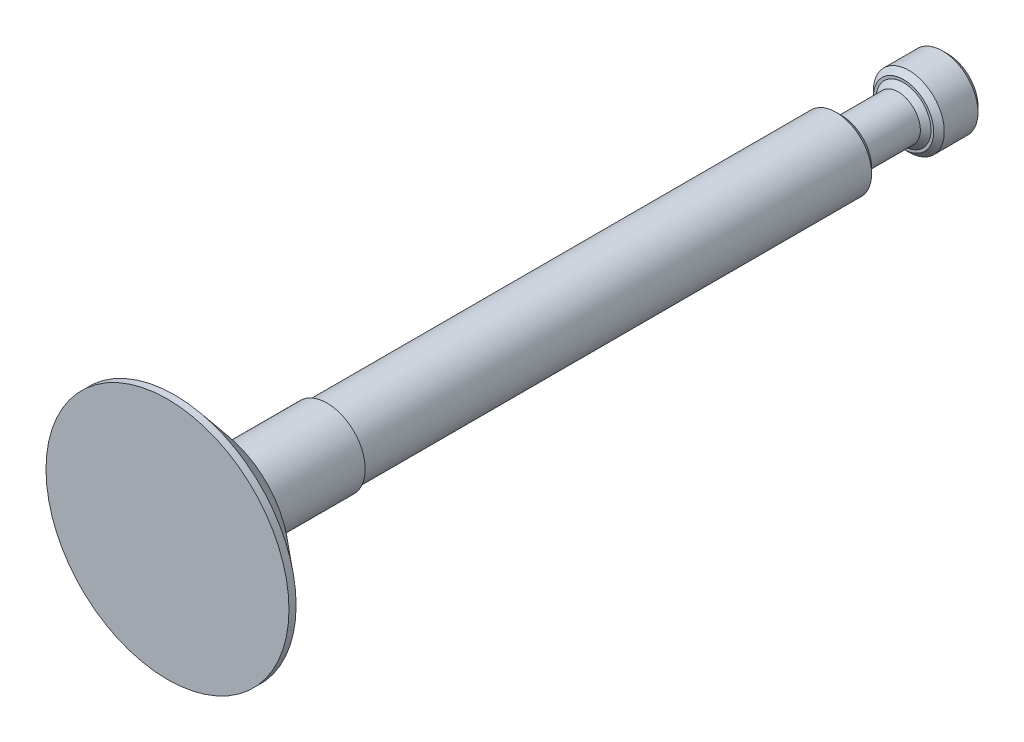
ISO-10303-21;
HEADER;
FILE_DESCRIPTION(('STEP AP214'),'2;1');
FILE_NAME('part.step','',(''),(''),'','','');
FILE_SCHEMA(('AUTOMOTIVE_DESIGN { 1 0 10303 214 1 1 1 1 }'));
ENDSEC;
DATA;
#1=APPLICATION_CONTEXT('core data for automotive mechanical design processes');
#2=APPLICATION_PROTOCOL_DEFINITION('international standard','automotive_design',2000,#1);
#3=PRODUCT_CONTEXT('',#1,'mechanical');
#4=PRODUCT('Part','Part','',(#3));
#5=PRODUCT_RELATED_PRODUCT_CATEGORY('part','',(#4));
#6=PRODUCT_DEFINITION_FORMATION('','',#4);
#7=PRODUCT_DEFINITION_CONTEXT('part definition',#1,'design');
#8=PRODUCT_DEFINITION('design','',#6,#7);
#9=PRODUCT_DEFINITION_SHAPE('','',#8);
#10=(LENGTH_UNIT() NAMED_UNIT(*) SI_UNIT(.MILLI.,.METRE.));
#11=(NAMED_UNIT(*) PLANE_ANGLE_UNIT() SI_UNIT($,.RADIAN.));
#12=(NAMED_UNIT(*) SI_UNIT($,.STERADIAN.) SOLID_ANGLE_UNIT());
#13=UNCERTAINTY_MEASURE_WITH_UNIT(LENGTH_MEASURE(1.E-05),#10,'distance_accuracy_value','');
#14=(GEOMETRIC_REPRESENTATION_CONTEXT(3) GLOBAL_UNCERTAINTY_ASSIGNED_CONTEXT((#13)) GLOBAL_UNIT_ASSIGNED_CONTEXT((#10,
#11,#12)) REPRESENTATION_CONTEXT('',''));
#15=CARTESIAN_POINT('',(0.,0.,0.));
#16=DIRECTION('',(0.,0.,1.));
#17=DIRECTION('',(1.,0.,0.));
#18=AXIS2_PLACEMENT_3D('',#15,#16,#17);
#19=CARTESIAN_POINT('',(0.,0.,2.5));
#20=DIRECTION('',(0.,0.,0.999999999999999));
#21=DIRECTION('',(0.999999999999999,0.,0.));
#22=AXIS2_PLACEMENT_3D('',#19,#20,#21);
#23=PLANE('',#22);
#24=CARTESIAN_POINT('',(0.,0.,2.5));
#25=DIRECTION('',(0.,0.,0.999999999999999));
#26=DIRECTION('',(0.999999999999999,0.,0.));
#27=AXIS2_PLACEMENT_3D('',#24,#25,#26);
#28=CIRCLE('',#27,1.7);
#29=CARTESIAN_POINT('',(-1.7,0.,2.5));
#30=VERTEX_POINT('',#29);
#31=EDGE_CURVE('E41',#30,#30,#28,.T.);
#32=ORIENTED_EDGE('',*,*,#31,.T.);
#33=EDGE_LOOP('',(#32));
#34=FACE_BOUND('',#33,.T.);
#35=CARTESIAN_POINT('',(0.,0.,2.5));
#36=DIRECTION('',(0.,0.,0.999999999999999));
#37=DIRECTION('',(0.999999999999999,0.,0.));
#38=AXIS2_PLACEMENT_3D('',#35,#36,#37);
#39=CIRCLE('',#38,1.55);
#40=CARTESIAN_POINT('',(-1.55,0.,2.5));
#41=VERTEX_POINT('',#40);
#42=EDGE_CURVE('E45',#41,#41,#39,.F.);
#43=ORIENTED_EDGE('',*,*,#42,.T.);
#44=EDGE_LOOP('',(#43));
#45=FACE_BOUND('',#44,.T.);
#46=ADVANCED_FACE('F30',(#34,#45),#23,.T.);
#47=CARTESIAN_POINT('',(0.,0.,2.5));
#48=DIRECTION('',(0.,0.,-0.999999999999999));
#49=DIRECTION('',(-0.999999999999999,0.,0.));
#50=AXIS2_PLACEMENT_3D('',#47,#48,#49);
#51=CYLINDRICAL_SURFACE('',#50,2.);
#52=CARTESIAN_POINT('',(0.,0.,0.299999999999995));
#53=DIRECTION('',(0.,0.,0.999999999999999));
#54=DIRECTION('',(0.999999999999999,0.,0.));
#55=AXIS2_PLACEMENT_3D('',#52,#53,#54);
#56=CIRCLE('',#55,2.);
#57=CARTESIAN_POINT('',(-2.,0.,0.299999999999994));
#58=VERTEX_POINT('',#57);
#59=EDGE_CURVE('E53',#58,#58,#56,.T.);
#60=CARTESIAN_POINT('',(0.,0.,2.20000000000001));
#61=DIRECTION('',(0.,0.,0.999999999999999));
#62=DIRECTION('',(0.999999999999999,0.,0.));
#63=AXIS2_PLACEMENT_3D('',#60,#61,#62);
#64=CIRCLE('',#63,2.);
#65=CARTESIAN_POINT('',(-2.,0.,2.20000000000001));
#66=VERTEX_POINT('',#65);
#67=EDGE_CURVE('E56',#66,#66,#64,.F.);
#68=CARTESIAN_POINT('',(-2.,0.,0.299999999999994));
#69=CARTESIAN_POINT('',(-2.,0.,0.319791666666661));
#70=CARTESIAN_POINT('',(-2.,0.,0.339583333333328));
#71=CARTESIAN_POINT('',(-2.,0.,0.379166666666661));
#72=CARTESIAN_POINT('',(-2.,0.,0.398958333333328));
#73=CARTESIAN_POINT('',(-2.,0.,0.438541666666662));
#74=CARTESIAN_POINT('',(-2.,0.,0.458333333333329));
#75=CARTESIAN_POINT('',(-2.,0.,0.497916666666662));
#76=CARTESIAN_POINT('',(-2.,0.,0.517708333333329));
#77=CARTESIAN_POINT('',(-2.,0.,0.557291666666663));
#78=CARTESIAN_POINT('',(-2.,0.,0.57708333333333));
#79=CARTESIAN_POINT('',(-2.,0.,0.616666666666663));
#80=CARTESIAN_POINT('',(-2.,0.,0.63645833333333));
#81=CARTESIAN_POINT('',(-2.,0.,0.676041666666664));
#82=CARTESIAN_POINT('',(-2.,0.,0.69583333333333));
#83=CARTESIAN_POINT('',(-2.,0.,0.735416666666664));
#84=CARTESIAN_POINT('',(-2.,0.,0.755208333333331));
#85=CARTESIAN_POINT('',(-2.,0.,0.794791666666664));
#86=CARTESIAN_POINT('',(-2.,0.,0.814583333333331));
#87=CARTESIAN_POINT('',(-2.,0.,0.854166666666665));
#88=CARTESIAN_POINT('',(-2.,0.,0.873958333333332));
#89=CARTESIAN_POINT('',(-2.,0.,0.913541666666665));
#90=CARTESIAN_POINT('',(-2.,0.,0.933333333333332));
#91=CARTESIAN_POINT('',(-2.,0.,0.972916666666666));
#92=CARTESIAN_POINT('',(-2.,0.,0.992708333333332));
#93=CARTESIAN_POINT('',(-2.,0.,1.03229166666667));
#94=CARTESIAN_POINT('',(-2.,0.,1.05208333333333));
#95=CARTESIAN_POINT('',(-2.,0.,1.09166666666667));
#96=CARTESIAN_POINT('',(-2.,0.,1.11145833333333));
#97=CARTESIAN_POINT('',(-2.,0.,1.15104166666667));
#98=CARTESIAN_POINT('',(-2.,0.,1.17083333333333));
#99=CARTESIAN_POINT('',(-2.,0.,1.21041666666667));
#100=CARTESIAN_POINT('',(-2.,0.,1.23020833333333));
#101=CARTESIAN_POINT('',(-2.,0.,1.26979166666667));
#102=CARTESIAN_POINT('',(-2.,0.,1.28958333333333));
#103=CARTESIAN_POINT('',(-2.,0.,1.32916666666667));
#104=CARTESIAN_POINT('',(-2.,0.,1.34895833333333));
#105=CARTESIAN_POINT('',(-2.,0.,1.38854166666667));
#106=CARTESIAN_POINT('',(-2.,0.,1.40833333333334));
#107=CARTESIAN_POINT('',(-2.,0.,1.44791666666667));
#108=CARTESIAN_POINT('',(-2.,0.,1.46770833333334));
#109=CARTESIAN_POINT('',(-2.,0.,1.50729166666667));
#110=CARTESIAN_POINT('',(-2.,0.,1.52708333333334));
#111=CARTESIAN_POINT('',(-2.,0.,1.56666666666667));
#112=CARTESIAN_POINT('',(-2.,0.,1.58645833333334));
#113=CARTESIAN_POINT('',(-2.,0.,1.62604166666667));
#114=CARTESIAN_POINT('',(-2.,0.,1.64583333333334));
#115=CARTESIAN_POINT('',(-2.,0.,1.68541666666667));
#116=CARTESIAN_POINT('',(-2.,0.,1.70520833333334));
#117=CARTESIAN_POINT('',(-2.,0.,1.74479166666667));
#118=CARTESIAN_POINT('',(-2.,0.,1.76458333333334));
#119=CARTESIAN_POINT('',(-2.,0.,1.80416666666667));
#120=CARTESIAN_POINT('',(-2.,0.,1.82395833333334));
#121=CARTESIAN_POINT('',(-2.,0.,1.86354166666667));
#122=CARTESIAN_POINT('',(-2.,0.,1.88333333333334));
#123=CARTESIAN_POINT('',(-2.,0.,1.92291666666667));
#124=CARTESIAN_POINT('',(-2.,0.,1.94270833333334));
#125=CARTESIAN_POINT('',(-2.,0.,1.98229166666667));
#126=CARTESIAN_POINT('',(-2.,0.,2.00208333333334));
#127=CARTESIAN_POINT('',(-2.,0.,2.04166666666667));
#128=CARTESIAN_POINT('',(-2.,0.,2.06145833333334));
#129=CARTESIAN_POINT('',(-2.,0.,2.10104166666667));
#130=CARTESIAN_POINT('',(-2.,0.,2.12083333333334));
#131=CARTESIAN_POINT('',(-2.,0.,2.16041666666667));
#132=CARTESIAN_POINT('',(-2.,0.,2.18020833333334));
#133=CARTESIAN_POINT('',(-2.,0.,2.20000000000001));
#134=B_SPLINE_CURVE_WITH_KNOTS('',3,(#68,#69,#70,#71,#72,#73,#74,#75,#76,#77,#78,#79,#80,#81,
#82,#83,#84,#85,#86,#87,#88,#89,#90,#91,#92,#93,#94,#95,#96,#97,#98,#99,#100,#101,#102,#103,
#104,#105,#106,#107,#108,#109,#110,#111,#112,#113,#114,#115,#116,#117,#118,#119,#120,#121,#122,
#123,#124,#125,#126,#127,#128,#129,#130,#131,#132,#133),.UNSPECIFIED.,.F.,.F.,(4,2,2,2,2,2,2,2,
2,2,2,2,2,2,2,2,2,2,2,2,2,2,2,2,2,2,2,2,2,2,2,2,4),(0.,0.0593750000000004,0.118750000000001,
0.178125000000001,0.237500000000002,0.296875000000002,0.356250000000003,0.415625000000003,
0.475000000000003,0.534375000000004,0.593750000000004,0.653125000000005,0.712500000000005,
0.771875000000005,0.831250000000006,0.890625000000006,0.950000000000007,1.00937500000001,
1.06875000000001,1.12812500000001,1.18750000000001,1.24687500000001,1.30625000000001,
1.36562500000001,1.42500000000001,1.48437500000001,1.54375000000001,1.60312500000001,
1.66250000000001,1.72187500000001,1.78125000000001,1.84062500000001,1.90000000000001),.UNSPECIFIED.);
#135=EDGE_CURVE('BSEAM32',#58,#66,#134,.T.);
#136=ORIENTED_EDGE('',*,*,#59,.T.);
#137=ORIENTED_EDGE('',*,*,#67,.T.);
#138=ORIENTED_EDGE('',*,*,#135,.T.);
#139=ORIENTED_EDGE('',*,*,#135,.F.);
#140=EDGE_LOOP('',(#136,#138,#137,#139));
#141=FACE_BOUND('',#140,.T.);
#142=ADVANCED_FACE('F32',(#141),#51,.T.);
#143=CARTESIAN_POINT('',(0.,0.,6.00000000000001));
#144=DIRECTION('',(0.,0.,-0.999999999999999));
#145=DIRECTION('',(-0.999999999999999,0.,0.));
#146=AXIS2_PLACEMENT_3D('',#143,#144,#145);
#147=CYLINDRICAL_SURFACE('',#146,1.25);
#148=CARTESIAN_POINT('',(0.,0.,5.69999999999998));
#149=DIRECTION('',(0.,0.,0.999999999999999));
#150=DIRECTION('',(0.999999999999999,0.,0.));
#151=AXIS2_PLACEMENT_3D('',#148,#149,#150);
#152=CIRCLE('',#151,1.25);
#153=CARTESIAN_POINT('',(-1.25,0.,5.69999999999998));
#154=VERTEX_POINT('',#153);
#155=EDGE_CURVE('E62',#154,#154,#152,.F.);
#156=CARTESIAN_POINT('',(0.,0.,2.8));
#157=DIRECTION('',(0.,0.,0.999999999999999));
#158=DIRECTION('',(0.999999999999999,0.,0.));
#159=AXIS2_PLACEMENT_3D('',#156,#157,#158);
#160=CIRCLE('',#159,1.25);
#161=CARTESIAN_POINT('',(-1.25,0.,2.8));
#162=VERTEX_POINT('',#161);
#163=EDGE_CURVE('E65',#162,#162,#160,.T.);
#164=CARTESIAN_POINT('',(-1.25,0.,5.69999999999998));
#165=CARTESIAN_POINT('',(-1.25,0.,5.66979166666665));
#166=CARTESIAN_POINT('',(-1.25,0.,5.63958333333332));
#167=CARTESIAN_POINT('',(-1.25,0.,5.57916666666665));
#168=CARTESIAN_POINT('',(-1.25,0.,5.54895833333332));
#169=CARTESIAN_POINT('',(-1.25,0.,5.48854166666665));
#170=CARTESIAN_POINT('',(-1.25,0.,5.45833333333332));
#171=CARTESIAN_POINT('',(-1.25,0.,5.39791666666665));
#172=CARTESIAN_POINT('',(-1.25,0.,5.36770833333332));
#173=CARTESIAN_POINT('',(-1.25,0.,5.30729166666665));
#174=CARTESIAN_POINT('',(-1.25,0.,5.27708333333332));
#175=CARTESIAN_POINT('',(-1.25,0.,5.21666666666665));
#176=CARTESIAN_POINT('',(-1.25,0.,5.18645833333332));
#177=CARTESIAN_POINT('',(-1.25,0.,5.12604166666665));
#178=CARTESIAN_POINT('',(-1.25,0.,5.09583333333332));
#179=CARTESIAN_POINT('',(-1.25,0.,5.03541666666665));
#180=CARTESIAN_POINT('',(-1.25,0.,5.00520833333332));
#181=CARTESIAN_POINT('',(-1.25,0.,4.94479166666665));
#182=CARTESIAN_POINT('',(-1.25,0.,4.91458333333332));
#183=CARTESIAN_POINT('',(-1.25,0.,4.85416666666665));
#184=CARTESIAN_POINT('',(-1.25,0.,4.82395833333332));
#185=CARTESIAN_POINT('',(-1.25,0.,4.76354166666665));
#186=CARTESIAN_POINT('',(-1.25,0.,4.73333333333332));
#187=CARTESIAN_POINT('',(-1.25,0.,4.67291666666665));
#188=CARTESIAN_POINT('',(-1.25,0.,4.64270833333332));
#189=CARTESIAN_POINT('',(-1.25,0.,4.58229166666665));
#190=CARTESIAN_POINT('',(-1.25,0.,4.55208333333332));
#191=CARTESIAN_POINT('',(-1.25,0.,4.49166666666665));
#192=CARTESIAN_POINT('',(-1.25,0.,4.46145833333332));
#193=CARTESIAN_POINT('',(-1.25,0.,4.40104166666666));
#194=CARTESIAN_POINT('',(-1.25,0.,4.37083333333332));
#195=CARTESIAN_POINT('',(-1.25,0.,4.31041666666666));
#196=CARTESIAN_POINT('',(-1.25,0.,4.28020833333332));
#197=CARTESIAN_POINT('',(-1.25,0.,4.21979166666666));
#198=CARTESIAN_POINT('',(-1.25,0.,4.18958333333332));
#199=CARTESIAN_POINT('',(-1.25,0.,4.12916666666666));
#200=CARTESIAN_POINT('',(-1.25,0.,4.09895833333332));
#201=CARTESIAN_POINT('',(-1.25,0.,4.03854166666666));
#202=CARTESIAN_POINT('',(-1.25,0.,4.00833333333332));
#203=CARTESIAN_POINT('',(-1.25,0.,3.94791666666666));
#204=CARTESIAN_POINT('',(-1.25,0.,3.91770833333332));
#205=CARTESIAN_POINT('',(-1.25,0.,3.85729166666666));
#206=CARTESIAN_POINT('',(-1.25,0.,3.82708333333332));
#207=CARTESIAN_POINT('',(-1.25,0.,3.76666666666666));
#208=CARTESIAN_POINT('',(-1.25,0.,3.73645833333333));
#209=CARTESIAN_POINT('',(-1.25,0.,3.67604166666666));
#210=CARTESIAN_POINT('',(-1.25,0.,3.64583333333333));
#211=CARTESIAN_POINT('',(-1.25,0.,3.58541666666666));
#212=CARTESIAN_POINT('',(-1.25,0.,3.55520833333333));
#213=CARTESIAN_POINT('',(-1.25,0.,3.49479166666666));
#214=CARTESIAN_POINT('',(-1.25,0.,3.46458333333333));
#215=CARTESIAN_POINT('',(-1.25,0.,3.40416666666666));
#216=CARTESIAN_POINT('',(-1.25,0.,3.37395833333333));
#217=CARTESIAN_POINT('',(-1.25,0.,3.31354166666666));
#218=CARTESIAN_POINT('',(-1.25,0.,3.28333333333333));
#219=CARTESIAN_POINT('',(-1.25,0.,3.22291666666666));
#220=CARTESIAN_POINT('',(-1.25,0.,3.19270833333333));
#221=CARTESIAN_POINT('',(-1.25,0.,3.13229166666666));
#222=CARTESIAN_POINT('',(-1.25,0.,3.10208333333333));
#223=CARTESIAN_POINT('',(-1.25,0.,3.04166666666666));
#224=CARTESIAN_POINT('',(-1.25,0.,3.01145833333333));
#225=CARTESIAN_POINT('',(-1.25,0.,2.95104166666666));
#226=CARTESIAN_POINT('',(-1.25,0.,2.92083333333333));
#227=CARTESIAN_POINT('',(-1.25,0.,2.86041666666666));
#228=CARTESIAN_POINT('',(-1.25,0.,2.83020833333333));
#229=CARTESIAN_POINT('',(-1.25,0.,2.8));
#230=B_SPLINE_CURVE_WITH_KNOTS('',3,(#164,#165,#166,#167,#168,#169,#170,#171,#172,#173,#174,
#175,#176,#177,#178,#179,#180,#181,#182,#183,#184,#185,#186,#187,#188,#189,#190,#191,#192,#193,
#194,#195,#196,#197,#198,#199,#200,#201,#202,#203,#204,#205,#206,#207,#208,#209,#210,#211,#212,
#213,#214,#215,#216,#217,#218,#219,#220,#221,#222,#223,#224,#225,#226,#227,#228,#229),
.UNSPECIFIED.,.F.,.F.,(4,2,2,2,2,2,2,2,2,2,2,2,2,2,2,2,2,2,2,2,2,2,2,2,2,2,2,2,2,2,2,2,4),(0.,
0.0906250000000004,0.181249999999999,0.271875,0.362499999999998,0.453124999999998,
0.543749999999997,0.634374999999998,0.724999999999997,0.815624999999997,0.906249999999996,
0.996874999999996,1.08749999999999,1.17812499999999,1.26874999999999,1.35937499999999,
1.44999999999999,1.54062499999999,1.63124999999999,1.72187499999999,1.81249999999999,
1.90312499999999,1.99374999999999,2.08437499999999,2.17499999999999,2.26562499999999,
2.35624999999999,2.44687499999999,2.53749999999999,2.62812499999999,2.71874999999999,
2.80937499999999,2.89999999999999),.UNSPECIFIED.);
#231=EDGE_CURVE('BSEAM107',#154,#162,#230,.T.);
#232=ORIENTED_EDGE('',*,*,#155,.T.);
#233=ORIENTED_EDGE('',*,*,#163,.T.);
#234=ORIENTED_EDGE('',*,*,#231,.T.);
#235=ORIENTED_EDGE('',*,*,#231,.F.);
#236=EDGE_LOOP('',(#232,#234,#233,#235));
#237=FACE_BOUND('',#236,.T.);
#238=ADVANCED_FACE('F107',(#237),#147,.T.);
#239=CARTESIAN_POINT('',(0.,0.,6.00000000000001));
#240=DIRECTION('',(0.,0.,0.999999999999999));
#241=DIRECTION('',(0.999999999999999,0.,0.));
#242=AXIS2_PLACEMENT_3D('',#239,#240,#241);
#243=PLANE('',#242);
#244=CARTESIAN_POINT('',(0.,0.,6.00000000000001));
#245=DIRECTION('',(0.,0.,0.999999999999999));
#246=DIRECTION('',(0.999999999999999,0.,0.));
#247=AXIS2_PLACEMENT_3D('',#244,#245,#246);
#248=CIRCLE('',#247,1.55);
#249=CARTESIAN_POINT('',(1.55,0.,6.00000000000001));
#250=VERTEX_POINT('',#249);
#251=EDGE_CURVE('E68',#250,#250,#248,.T.);
#252=ORIENTED_EDGE('',*,*,#251,.T.);
#253=EDGE_LOOP('',(#252));
#254=FACE_BOUND('',#253,.T.);
#255=CARTESIAN_POINT('',(0.,0.,6.00000000000001));
#256=DIRECTION('',(0.,0.,0.999999999999999));
#257=DIRECTION('',(0.999999999999999,0.,0.));
#258=AXIS2_PLACEMENT_3D('',#255,#256,#257);
#259=CIRCLE('',#258,1.7);
#260=CARTESIAN_POINT('',(1.69999999999999,0.,6.00000000000001));
#261=VERTEX_POINT('',#260);
#262=EDGE_CURVE('E71',#261,#261,#259,.F.);
#263=ORIENTED_EDGE('',*,*,#262,.T.);
#264=EDGE_LOOP('',(#263));
#265=FACE_BOUND('',#264,.T.);
#266=ADVANCED_FACE('F113',(#254,#265),#243,.F.);
#267=CARTESIAN_POINT('',(0.,0.,34.9999999999999));
#268=DIRECTION('',(0.,0.,-0.999999999999999));
#269=DIRECTION('',(-0.999999999999999,0.,0.));
#270=AXIS2_PLACEMENT_3D('',#267,#268,#269);
#271=CYLINDRICAL_SURFACE('',#270,2.);
#272=CARTESIAN_POINT('',(0.,0.,6.3));
#273=DIRECTION('',(0.,0.,0.999999999999999));
#274=DIRECTION('',(0.999999999999999,0.,0.));
#275=AXIS2_PLACEMENT_3D('',#272,#273,#274);
#276=CIRCLE('',#275,2.);
#277=CARTESIAN_POINT('',(-2.,0.,6.3));
#278=VERTEX_POINT('',#277);
#279=EDGE_CURVE('E59',#278,#278,#276,.T.);
#280=CARTESIAN_POINT('',(0.,0.,34.9999999999999));
#281=DIRECTION('',(0.,0.,0.999999999999999));
#282=DIRECTION('',(0.999999999999999,0.,0.));
#283=AXIS2_PLACEMENT_3D('',#280,#281,#282);
#284=CIRCLE('',#283,2.);
#285=CARTESIAN_POINT('',(-2.,0.,34.9999999999999));
#286=VERTEX_POINT('',#285);
#287=EDGE_CURVE('E74',#286,#286,#284,.T.);
#288=CARTESIAN_POINT('',(-2.,0.,6.3));
#289=CARTESIAN_POINT('',(-2.,0.,6.59895833333333));
#290=CARTESIAN_POINT('',(-2.,0.,6.89791666666667));
#291=CARTESIAN_POINT('',(-2.,0.,7.49583333333333));
#292=CARTESIAN_POINT('',(-2.,0.,7.79479166666666));
#293=CARTESIAN_POINT('',(-2.,0.,8.39270833333333));
#294=CARTESIAN_POINT('',(-2.,0.,8.69166666666666));
#295=CARTESIAN_POINT('',(-2.,0.,9.28958333333333));
#296=CARTESIAN_POINT('',(-2.,0.,9.58854166666666));
#297=CARTESIAN_POINT('',(-2.,0.,10.1864583333333));
#298=CARTESIAN_POINT('',(-2.,0.,10.4854166666667));
#299=CARTESIAN_POINT('',(-2.,0.,11.0833333333333));
#300=CARTESIAN_POINT('',(-2.,0.,11.3822916666667));
#301=CARTESIAN_POINT('',(-2.,0.,11.9802083333333));
#302=CARTESIAN_POINT('',(-2.,0.,12.2791666666667));
#303=CARTESIAN_POINT('',(-2.,0.,12.8770833333333));
#304=CARTESIAN_POINT('',(-2.,0.,13.1760416666667));
#305=CARTESIAN_POINT('',(-2.,0.,13.7739583333333));
#306=CARTESIAN_POINT('',(-2.,0.,14.0729166666666));
#307=CARTESIAN_POINT('',(-2.,0.,14.6708333333333));
#308=CARTESIAN_POINT('',(-2.,0.,14.9697916666666));
#309=CARTESIAN_POINT('',(-2.,0.,15.5677083333333));
#310=CARTESIAN_POINT('',(-2.,0.,15.8666666666666));
#311=CARTESIAN_POINT('',(-2.,0.,16.4645833333333));
#312=CARTESIAN_POINT('',(-2.,0.,16.7635416666666));
#313=CARTESIAN_POINT('',(-2.,0.,17.3614583333333));
#314=CARTESIAN_POINT('',(-2.,0.,17.6604166666666));
#315=CARTESIAN_POINT('',(-2.,0.,18.2583333333333));
#316=CARTESIAN_POINT('',(-2.,0.,18.5572916666666));
#317=CARTESIAN_POINT('',(-2.,0.,19.1552083333333));
#318=CARTESIAN_POINT('',(-2.,0.,19.4541666666666));
#319=CARTESIAN_POINT('',(-2.,0.,20.0520833333333));
#320=CARTESIAN_POINT('',(-2.,0.,20.3510416666666));
#321=CARTESIAN_POINT('',(-2.,0.,20.9489583333333));
#322=CARTESIAN_POINT('',(-2.,0.,21.2479166666666));
#323=CARTESIAN_POINT('',(-2.,0.,21.8458333333333));
#324=CARTESIAN_POINT('',(-2.,0.,22.1447916666666));
#325=CARTESIAN_POINT('',(-2.,0.,22.7427083333333));
#326=CARTESIAN_POINT('',(-2.,0.,23.0416666666666));
#327=CARTESIAN_POINT('',(-2.,0.,23.6395833333333));
#328=CARTESIAN_POINT('',(-2.,0.,23.9385416666666));
#329=CARTESIAN_POINT('',(-2.,0.,24.5364583333333));
#330=CARTESIAN_POINT('',(-2.,0.,24.8354166666666));
#331=CARTESIAN_POINT('',(-2.,0.,25.4333333333333));
#332=CARTESIAN_POINT('',(-2.,0.,25.7322916666666));
#333=CARTESIAN_POINT('',(-2.,0.,26.3302083333333));
#334=CARTESIAN_POINT('',(-2.,0.,26.6291666666666));
#335=CARTESIAN_POINT('',(-2.,0.,27.2270833333333));
#336=CARTESIAN_POINT('',(-2.,0.,27.5260416666666));
#337=CARTESIAN_POINT('',(-2.,0.,28.1239583333333));
#338=CARTESIAN_POINT('',(-2.,0.,28.4229166666666));
#339=CARTESIAN_POINT('',(-2.,0.,29.0208333333333));
#340=CARTESIAN_POINT('',(-2.,0.,29.3197916666666));
#341=CARTESIAN_POINT('',(-2.,0.,29.9177083333333));
#342=CARTESIAN_POINT('',(-2.,0.,30.2166666666666));
#343=CARTESIAN_POINT('',(-2.,0.,30.8145833333333));
#344=CARTESIAN_POINT('',(-2.,0.,31.1135416666666));
#345=CARTESIAN_POINT('',(-2.,0.,31.7114583333333));
#346=CARTESIAN_POINT('',(-2.,0.,32.0104166666666));
#347=CARTESIAN_POINT('',(-2.,0.,32.6083333333333));
#348=CARTESIAN_POINT('',(-2.,0.,32.9072916666666));
#349=CARTESIAN_POINT('',(-2.,0.,33.5052083333333));
#350=CARTESIAN_POINT('',(-2.,0.,33.8041666666666));
#351=CARTESIAN_POINT('',(-2.,0.,34.4020833333333));
#352=CARTESIAN_POINT('',(-2.,0.,34.7010416666666));
#353=CARTESIAN_POINT('',(-2.,0.,34.9999999999999));
#354=B_SPLINE_CURVE_WITH_KNOTS('',3,(#288,#289,#290,#291,#292,#293,#294,#295,#296,#297,#298,
#299,#300,#301,#302,#303,#304,#305,#306,#307,#308,#309,#310,#311,#312,#313,#314,#315,#316,#317,
#318,#319,#320,#321,#322,#323,#324,#325,#326,#327,#328,#329,#330,#331,#332,#333,#334,#335,#336,
#337,#338,#339,#340,#341,#342,#343,#344,#345,#346,#347,#348,#349,#350,#351,#352,#353),
.UNSPECIFIED.,.F.,.F.,(4,2,2,2,2,2,2,2,2,2,2,2,2,2,2,2,2,2,2,2,2,2,2,2,2,2,2,2,2,2,2,2,4),(0.,
0.896874999999998,1.79375,2.69062499999999,3.58749999999999,4.48437499999999,5.38124999999999,
6.27812499999999,7.17499999999998,8.07187499999998,8.96874999999998,9.86562499999997,10.7625,
11.659375,12.55625,13.453125,14.35,15.246875,16.14375,17.040625,17.9375,18.834375,19.73125,
20.628125,21.5249999999999,22.4218749999999,23.3187499999999,24.2156249999999,25.1124999999999,
26.0093749999999,26.9062499999999,27.8031249999999,28.6999999999999),.UNSPECIFIED.);
#355=EDGE_CURVE('BSEAM115',#278,#286,#354,.T.);
#356=ORIENTED_EDGE('',*,*,#279,.T.);
#357=ORIENTED_EDGE('',*,*,#287,.F.);
#358=ORIENTED_EDGE('',*,*,#355,.T.);
#359=ORIENTED_EDGE('',*,*,#355,.F.);
#360=EDGE_LOOP('',(#356,#358,#357,#359));
#361=FACE_BOUND('',#360,.T.);
#362=ADVANCED_FACE('F115',(#361),#271,.T.);
#363=CARTESIAN_POINT('',(0.,0.,34.9999999999999));
#364=DIRECTION('',(0.,0.,0.999999999999999));
#365=DIRECTION('',(0.999999999999999,0.,0.));
#366=AXIS2_PLACEMENT_3D('',#363,#364,#365);
#367=PLANE('',#366);
#368=CARTESIAN_POINT('',(0.,0.,34.9999999999999));
#369=DIRECTION('',(0.,0.,0.999999999999999));
#370=DIRECTION('',(0.999999999999999,0.,0.));
#371=AXIS2_PLACEMENT_3D('',#368,#369,#370);
#372=CIRCLE('',#371,2.15);
#373=CARTESIAN_POINT('',(-2.15,0.,34.9999999999999));
#374=VERTEX_POINT('',#373);
#375=EDGE_CURVE('E80',#374,#374,#372,.T.);
#376=ORIENTED_EDGE('',*,*,#375,.F.);
#377=EDGE_LOOP('',(#376));
#378=FACE_BOUND('',#377,.T.);
#379=ORIENTED_EDGE('',*,*,#287,.T.);
#380=EDGE_LOOP('',(#379));
#381=FACE_BOUND('',#380,.T.);
#382=ADVANCED_FACE('F118',(#378,#381),#367,.F.);
#383=CARTESIAN_POINT('',(0.,0.,41.4999999999999));
#384=DIRECTION('',(0.,0.,-0.999999999999999));
#385=DIRECTION('',(-0.999999999999999,0.,0.));
#386=AXIS2_PLACEMENT_3D('',#383,#384,#385);
#387=CYLINDRICAL_SURFACE('',#386,2.15);
#388=CARTESIAN_POINT('',(0.,0.,41.4999999999999));
#389=DIRECTION('',(0.,0.,0.999999999999999));
#390=DIRECTION('',(0.999999999999999,0.,0.));
#391=AXIS2_PLACEMENT_3D('',#388,#389,#390);
#392=CIRCLE('',#391,2.15);
#393=CARTESIAN_POINT('',(-2.15,0.,41.4999999999999));
#394=VERTEX_POINT('',#393);
#395=EDGE_CURVE('E77',#394,#394,#392,.T.);
#396=CARTESIAN_POINT('',(-2.15,0.,41.4999999999999));
#397=CARTESIAN_POINT('',(-2.15,0.,41.4322916666666));
#398=CARTESIAN_POINT('',(-2.15,0.,41.3645833333333));
#399=CARTESIAN_POINT('',(-2.15,0.,41.2291666666666));
#400=CARTESIAN_POINT('',(-2.15,0.,41.1614583333333));
#401=CARTESIAN_POINT('',(-2.15,0.,41.0260416666666));
#402=CARTESIAN_POINT('',(-2.15,0.,40.9583333333333));
#403=CARTESIAN_POINT('',(-2.15,0.,40.8229166666666));
#404=CARTESIAN_POINT('',(-2.15,0.,40.7552083333333));
#405=CARTESIAN_POINT('',(-2.15,0.,40.6197916666666));
#406=CARTESIAN_POINT('',(-2.15,0.,40.5520833333333));
#407=CARTESIAN_POINT('',(-2.15,0.,40.4166666666666));
#408=CARTESIAN_POINT('',(-2.15,0.,40.3489583333333));
#409=CARTESIAN_POINT('',(-2.15,0.,40.2135416666666));
#410=CARTESIAN_POINT('',(-2.15,0.,40.1458333333333));
#411=CARTESIAN_POINT('',(-2.15,0.,40.0104166666666));
#412=CARTESIAN_POINT('',(-2.15,0.,39.9427083333333));
#413=CARTESIAN_POINT('',(-2.15,0.,39.8072916666666));
#414=CARTESIAN_POINT('',(-2.15,0.,39.7395833333333));
#415=CARTESIAN_POINT('',(-2.15,0.,39.6041666666666));
#416=CARTESIAN_POINT('',(-2.15,0.,39.5364583333333));
#417=CARTESIAN_POINT('',(-2.15,0.,39.4010416666666));
#418=CARTESIAN_POINT('',(-2.15,0.,39.3333333333333));
#419=CARTESIAN_POINT('',(-2.15,0.,39.1979166666666));
#420=CARTESIAN_POINT('',(-2.15,0.,39.1302083333333));
#421=CARTESIAN_POINT('',(-2.15,0.,38.9947916666666));
#422=CARTESIAN_POINT('',(-2.15,0.,38.9270833333333));
#423=CARTESIAN_POINT('',(-2.15,0.,38.7916666666666));
#424=CARTESIAN_POINT('',(-2.15,0.,38.7239583333333));
#425=CARTESIAN_POINT('',(-2.15,0.,38.5885416666666));
#426=CARTESIAN_POINT('',(-2.15,0.,38.5208333333333));
#427=CARTESIAN_POINT('',(-2.15,0.,38.3854166666666));
#428=CARTESIAN_POINT('',(-2.15,0.,38.3177083333333));
#429=CARTESIAN_POINT('',(-2.15,0.,38.1822916666666));
#430=CARTESIAN_POINT('',(-2.15,0.,38.1145833333333));
#431=CARTESIAN_POINT('',(-2.15,0.,37.9791666666666));
#432=CARTESIAN_POINT('',(-2.15,0.,37.9114583333333));
#433=CARTESIAN_POINT('',(-2.15,0.,37.7760416666666));
#434=CARTESIAN_POINT('',(-2.15,0.,37.7083333333333));
#435=CARTESIAN_POINT('',(-2.15,0.,37.5729166666666));
#436=CARTESIAN_POINT('',(-2.15,0.,37.5052083333333));
#437=CARTESIAN_POINT('',(-2.15,0.,37.3697916666666));
#438=CARTESIAN_POINT('',(-2.15,0.,37.3020833333333));
#439=CARTESIAN_POINT('',(-2.15,0.,37.1666666666666));
#440=CARTESIAN_POINT('',(-2.15,0.,37.0989583333333));
#441=CARTESIAN_POINT('',(-2.15,0.,36.9635416666666));
#442=CARTESIAN_POINT('',(-2.15,0.,36.8958333333333));
#443=CARTESIAN_POINT('',(-2.15,0.,36.7604166666666));
#444=CARTESIAN_POINT('',(-2.15,0.,36.6927083333333));
#445=CARTESIAN_POINT('',(-2.15,0.,36.5572916666666));
#446=CARTESIAN_POINT('',(-2.15,0.,36.4895833333333));
#447=CARTESIAN_POINT('',(-2.15,0.,36.3541666666666));
#448=CARTESIAN_POINT('',(-2.15,0.,36.2864583333333));
#449=CARTESIAN_POINT('',(-2.15,0.,36.1510416666666));
#450=CARTESIAN_POINT('',(-2.15,0.,36.0833333333333));
#451=CARTESIAN_POINT('',(-2.15,0.,35.9479166666666));
#452=CARTESIAN_POINT('',(-2.15,0.,35.8802083333333));
#453=CARTESIAN_POINT('',(-2.15,0.,35.7447916666666));
#454=CARTESIAN_POINT('',(-2.15,0.,35.6770833333333));
#455=CARTESIAN_POINT('',(-2.15,0.,35.5416666666666));
#456=CARTESIAN_POINT('',(-2.15,0.,35.4739583333333));
#457=CARTESIAN_POINT('',(-2.15,0.,35.3385416666666));
#458=CARTESIAN_POINT('',(-2.15,0.,35.2708333333333));
#459=CARTESIAN_POINT('',(-2.15,0.,35.1354166666666));
#460=CARTESIAN_POINT('',(-2.15,0.,35.0677083333333));
#461=CARTESIAN_POINT('',(-2.15,0.,34.9999999999999));
#462=B_SPLINE_CURVE_WITH_KNOTS('',3,(#396,#397,#398,#399,#400,#401,#402,#403,#404,#405,#406,
#407,#408,#409,#410,#411,#412,#413,#414,#415,#416,#417,#418,#419,#420,#421,#422,#423,#424,#425,
#426,#427,#428,#429,#430,#431,#432,#433,#434,#435,#436,#437,#438,#439,#440,#441,#442,#443,#444,
#445,#446,#447,#448,#449,#450,#451,#452,#453,#454,#455,#456,#457,#458,#459,#460,#461),
.UNSPECIFIED.,.F.,.F.,(4,2,2,2,2,2,2,2,2,2,2,2,2,2,2,2,2,2,2,2,2,2,2,2,2,2,2,2,2,2,2,2,4),(0.,
0.203124999999998,0.406249999999997,0.609374999999995,0.812500000000001,1.015625,1.21875,
1.421875,1.62499999999999,1.828125,2.03125,2.234375,2.4375,2.640625,2.84375,3.046875,3.25,
3.453125,3.65625,3.859375,4.0625,4.265625,4.46875,4.671875,4.875,5.078125,5.28125,5.484375,
5.68750000000001,5.890625,6.09375,6.296875,6.5),.UNSPECIFIED.);
#463=EDGE_CURVE('BSEAM99',#394,#374,#462,.T.);
#464=ORIENTED_EDGE('',*,*,#395,.F.);
#465=ORIENTED_EDGE('',*,*,#375,.T.);
#466=ORIENTED_EDGE('',*,*,#463,.T.);
#467=ORIENTED_EDGE('',*,*,#463,.F.);
#468=EDGE_LOOP('',(#464,#466,#465,#467));
#469=FACE_BOUND('',#468,.T.);
#470=ADVANCED_FACE('F99',(#469),#387,.T.);
#471=CARTESIAN_POINT('',(0.,0.,41.4999999999999));
#472=DIRECTION('',(0.,0.,0.999999999999999));
#473=DIRECTION('',(0.999999999999999,0.,0.));
#474=AXIS2_PLACEMENT_3D('',#471,#472,#473);
#475=PLANE('',#474);
#476=CARTESIAN_POINT('',(0.,0.,41.4999999999999));
#477=DIRECTION('',(0.,0.,0.999999999999999));
#478=DIRECTION('',(0.999999999999999,0.,0.));
#479=AXIS2_PLACEMENT_3D('',#476,#477,#478);
#480=CIRCLE('',#479,4.34999999999999);
#481=CARTESIAN_POINT('',(4.34999999999998,0.,41.4999999999999));
#482=VERTEX_POINT('',#481);
#483=EDGE_CURVE('E10',#482,#482,#480,.F.);
#484=ORIENTED_EDGE('',*,*,#483,.T.);
#485=EDGE_LOOP('',(#484));
#486=FACE_BOUND('',#485,.T.);
#487=ORIENTED_EDGE('',*,*,#395,.T.);
#488=EDGE_LOOP('',(#487));
#489=FACE_BOUND('',#488,.T.);
#490=ADVANCED_FACE('F91',(#486,#489),#475,.F.);
#491=CARTESIAN_POINT('',(0.,0.,43.9999999999999));
#492=DIRECTION('',(0.,0.,-0.999999999999999));
#493=DIRECTION('',(-0.999999999999999,0.,0.));
#494=AXIS2_PLACEMENT_3D('',#491,#492,#493);
#495=CYLINDRICAL_SURFACE('',#494,6.85);
#496=CARTESIAN_POINT('',(0.,0.,43.5977490779431));
#497=DIRECTION('',(0.,0.,0.999999999999999));
#498=DIRECTION('',(0.999999999999999,0.,0.));
#499=AXIS2_PLACEMENT_3D('',#496,#497,#498);
#500=CIRCLE('',#499,6.85);
#501=CARTESIAN_POINT('',(-6.85,0.,43.5977490779431));
#502=VERTEX_POINT('',#501);
#503=EDGE_CURVE('E37',#502,#502,#500,.T.);
#504=CARTESIAN_POINT('',(0.,0.,43.9999999999999));
#505=DIRECTION('',(0.,0.,0.999999999999999));
#506=DIRECTION('',(0.999999999999999,0.,0.));
#507=AXIS2_PLACEMENT_3D('',#504,#505,#506);
#508=CIRCLE('',#507,6.85);
#509=CARTESIAN_POINT('',(-6.85,0.,43.9999999999999));
#510=VERTEX_POINT('',#509);
#511=EDGE_CURVE('E83',#510,#510,#508,.T.);
#512=CARTESIAN_POINT('',(-6.85,0.,43.5977490779431));
#513=CARTESIAN_POINT('',(-6.85,0.,43.6019391917145));
#514=CARTESIAN_POINT('',(-6.85,0.,43.606129305486));
#515=CARTESIAN_POINT('',(-6.85,0.,43.6145095330288));
#516=CARTESIAN_POINT('',(-6.85,0.,43.6186996468003));
#517=CARTESIAN_POINT('',(-6.85,0.,43.6270798743431));
#518=CARTESIAN_POINT('',(-6.85,0.,43.6312699881145));
#519=CARTESIAN_POINT('',(-6.85,0.,43.6396502156574));
#520=CARTESIAN_POINT('',(-6.85,0.,43.6438403294288));
#521=CARTESIAN_POINT('',(-6.85,0.,43.6522205569716));
#522=CARTESIAN_POINT('',(-6.85,0.,43.6564106707431));
#523=CARTESIAN_POINT('',(-6.85,0.,43.6647908982859));
#524=CARTESIAN_POINT('',(-6.85,0.,43.6689810120574));
#525=CARTESIAN_POINT('',(-6.85,0.,43.6773612396002));
#526=CARTESIAN_POINT('',(-6.85,0.,43.6815513533716));
#527=CARTESIAN_POINT('',(-6.85,0.,43.6899315809145));
#528=CARTESIAN_POINT('',(-6.85,0.,43.6941216946859));
#529=CARTESIAN_POINT('',(-6.85,0.,43.7025019222288));
#530=CARTESIAN_POINT('',(-6.85,0.,43.7066920360002));
#531=CARTESIAN_POINT('',(-6.85,0.,43.715072263543));
#532=CARTESIAN_POINT('',(-6.85,0.,43.7192623773145));
#533=CARTESIAN_POINT('',(-6.85,0.,43.7276426048573));
#534=CARTESIAN_POINT('',(-6.85,0.,43.7318327186287));
#535=CARTESIAN_POINT('',(-6.85,0.,43.7402129461716));
#536=CARTESIAN_POINT('',(-6.85,0.,43.744403059943));
#537=CARTESIAN_POINT('',(-6.85,0.,43.7527832874858));
#538=CARTESIAN_POINT('',(-6.85,0.,43.7569734012573));
#539=CARTESIAN_POINT('',(-6.85,0.,43.7653536288001));
#540=CARTESIAN_POINT('',(-6.85,0.,43.7695437425716));
#541=CARTESIAN_POINT('',(-6.85,0.,43.7779239701144));
#542=CARTESIAN_POINT('',(-6.85,0.,43.7821140838858));
#543=CARTESIAN_POINT('',(-6.85,0.,43.7904943114287));
#544=CARTESIAN_POINT('',(-6.85,0.,43.7946844252001));
#545=CARTESIAN_POINT('',(-6.85,0.,43.803064652743));
#546=CARTESIAN_POINT('',(-6.85,0.,43.8072547665144));
#547=CARTESIAN_POINT('',(-6.85,0.,43.8156349940572));
#548=CARTESIAN_POINT('',(-6.85,0.,43.8198251078287));
#549=CARTESIAN_POINT('',(-6.85,0.,43.8282053353715));
#550=CARTESIAN_POINT('',(-6.85,0.,43.8323954491429));
#551=CARTESIAN_POINT('',(-6.85,0.,43.8407756766858));
#552=CARTESIAN_POINT('',(-6.85,0.,43.8449657904572));
#553=CARTESIAN_POINT('',(-6.85,0.,43.8533460180001));
#554=CARTESIAN_POINT('',(-6.85,0.,43.8575361317715));
#555=CARTESIAN_POINT('',(-6.85,0.,43.8659163593143));
#556=CARTESIAN_POINT('',(-6.85,0.,43.8701064730858));
#557=CARTESIAN_POINT('',(-6.85,0.,43.8784867006286));
#558=CARTESIAN_POINT('',(-6.85,0.,43.8826768144));
#559=CARTESIAN_POINT('',(-6.85,0.,43.8910570419429));
#560=CARTESIAN_POINT('',(-6.85,0.,43.8952471557143));
#561=CARTESIAN_POINT('',(-6.85,0.,43.9036273832572));
#562=CARTESIAN_POINT('',(-6.85,0.,43.9078174970286));
#563=CARTESIAN_POINT('',(-6.85,0.,43.9161977245714));
#564=CARTESIAN_POINT('',(-6.85,0.,43.9203878383429));
#565=CARTESIAN_POINT('',(-6.85,0.,43.9287680658857));
#566=CARTESIAN_POINT('',(-6.85,0.,43.9329581796571));
#567=CARTESIAN_POINT('',(-6.85,0.,43.9413384072));
#568=CARTESIAN_POINT('',(-6.85,0.,43.9455285209714));
#569=CARTESIAN_POINT('',(-6.85,0.,43.9539087485143));
#570=CARTESIAN_POINT('',(-6.85,0.,43.9580988622857));
#571=CARTESIAN_POINT('',(-6.85,0.,43.9664790898285));
#572=CARTESIAN_POINT('',(-6.85,0.,43.9706692036));
#573=CARTESIAN_POINT('',(-6.85,0.,43.9790494311428));
#574=CARTESIAN_POINT('',(-6.85,0.,43.9832395449142));
#575=CARTESIAN_POINT('',(-6.85,0.,43.9916197724571));
#576=CARTESIAN_POINT('',(-6.85,0.,43.9958098862285));
#577=CARTESIAN_POINT('',(-6.85,0.,43.9999999999999));
#578=B_SPLINE_CURVE_WITH_KNOTS('',3,(#512,#513,#514,#515,#516,#517,#518,#519,#520,#521,#522,
#523,#524,#525,#526,#527,#528,#529,#530,#531,#532,#533,#534,#535,#536,#537,#538,#539,#540,#541,
#542,#543,#544,#545,#546,#547,#548,#549,#550,#551,#552,#553,#554,#555,#556,#557,#558,#559,#560,
#561,#562,#563,#564,#565,#566,#567,#568,#569,#570,#571,#572,#573,#574,#575,#576,#577),
.UNSPECIFIED.,.F.,.F.,(4,2,2,2,2,2,2,2,2,2,2,2,2,2,2,2,2,2,2,2,2,2,2,2,2,2,2,2,2,2,2,2,4),(0.,
0.0125703413142789,0.0251406826285508,0.0377110239428297,0.0502813652571016,0.0628517065713805,
0.0754220478856524,0.0879923891999312,0.10056273051421,0.113133071828482,0.125703413142754,
0.138273754457033,0.150844095771305,0.163414437085584,0.175984778399856,0.188555119714134,
0.201125461028406,0.213695802342685,0.226266143656957,0.238836484971236,0.251406826285515,
0.263977167599787,0.276547508914059,0.289117850228338,0.30168819154261,0.314258532856888,
0.32682887417116,0.339399215485439,0.351969556799711,0.36453989811399,0.377110239428269,
0.389680580742541,0.40225092205682),.UNSPECIFIED.);
#579=EDGE_CURVE('BSEAM89',#502,#510,#578,.T.);
#580=ORIENTED_EDGE('',*,*,#503,.T.);
#581=ORIENTED_EDGE('',*,*,#511,.F.);
#582=ORIENTED_EDGE('',*,*,#579,.T.);
#583=ORIENTED_EDGE('',*,*,#579,.F.);
#584=EDGE_LOOP('',(#580,#582,#581,#583));
#585=FACE_BOUND('',#584,.T.);
#586=ADVANCED_FACE('F89',(#585),#495,.T.);
#587=CARTESIAN_POINT('',(0.,0.,43.9999999999999));
#588=DIRECTION('',(0.,0.,0.999999999999999));
#589=DIRECTION('',(0.999999999999999,0.,0.));
#590=AXIS2_PLACEMENT_3D('',#587,#588,#589);
#591=PLANE('',#590);
#592=ORIENTED_EDGE('',*,*,#511,.T.);
#593=EDGE_LOOP('',(#592));
#594=FACE_BOUND('',#593,.T.);
#595=ADVANCED_FACE('F87',(#594),#591,.T.);
#596=CARTESIAN_POINT('',(0.,0.,6.00000000000001));
#597=DIRECTION('',(0.,0.,0.999999999999999));
#598=DIRECTION('',(0.999999999999999,0.,0.));
#599=AXIS2_PLACEMENT_3D('',#596,#597,#598);
#600=CONICAL_SURFACE('',#599,1.55,0.785398163397443);
#601=ORIENTED_EDGE('',*,*,#155,.F.);
#602=EDGE_LOOP('',(#601));
#603=FACE_BOUND('',#602,.T.);
#604=ORIENTED_EDGE('',*,*,#251,.F.);
#605=EDGE_LOOP('',(#604));
#606=FACE_BOUND('',#605,.T.);
#607=ADVANCED_FACE('F97',(#603,#606),#600,.T.);
#608=CARTESIAN_POINT('',(0.,0.,6.3));
#609=DIRECTION('',(0.,0.,0.999999999999999));
#610=DIRECTION('',(0.999999999999999,0.,0.));
#611=AXIS2_PLACEMENT_3D('',#608,#609,#610);
#612=CONICAL_SURFACE('',#611,2.,0.785398163397443);
#613=ORIENTED_EDGE('',*,*,#262,.F.);
#614=EDGE_LOOP('',(#613));
#615=FACE_BOUND('',#614,.T.);
#616=ORIENTED_EDGE('',*,*,#279,.F.);
#617=EDGE_LOOP('',(#616));
#618=FACE_BOUND('',#617,.T.);
#619=ADVANCED_FACE('F163',(#615,#618),#612,.T.);
#620=CARTESIAN_POINT('',(0.,0.,0.299999999999995));
#621=DIRECTION('',(0.,0.,0.999999999999999));
#622=DIRECTION('',(0.999999999999999,0.,0.));
#623=AXIS2_PLACEMENT_3D('',#620,#621,#622);
#624=CONICAL_SURFACE('',#623,2.,0.785398163397443);
#625=CARTESIAN_POINT('',(0.,0.,0.));
#626=DIRECTION('',(0.,0.,0.999999999999999));
#627=DIRECTION('',(0.999999999999999,0.,0.));
#628=AXIS2_PLACEMENT_3D('',#625,#626,#627);
#629=CIRCLE('',#628,1.7);
#630=CARTESIAN_POINT('',(1.69999999999999,0.,0.));
#631=VERTEX_POINT('',#630);
#632=EDGE_CURVE('E50',#631,#631,#629,.F.);
#633=ORIENTED_EDGE('',*,*,#632,.F.);
#634=EDGE_LOOP('',(#633));
#635=FACE_BOUND('',#634,.T.);
#636=ORIENTED_EDGE('',*,*,#59,.F.);
#637=EDGE_LOOP('',(#636));
#638=FACE_BOUND('',#637,.T.);
#639=ADVANCED_FACE('F173',(#635,#638),#624,.T.);
#640=CARTESIAN_POINT('',(0.,0.,2.5));
#641=DIRECTION('',(0.,0.,-0.999999999999999));
#642=DIRECTION('',(-0.999999999999999,0.,0.));
#643=AXIS2_PLACEMENT_3D('',#640,#641,#642);
#644=CONICAL_SURFACE('',#643,1.7,0.785398163397443);
#645=CARTESIAN_POINT('',(-1.99999999999999,0.,2.20000000000001));
#646=CARTESIAN_POINT('',(-1.99687499999999,0.,2.20312500000001));
#647=CARTESIAN_POINT('',(-1.99374999999999,0.,2.20625000000001));
#648=CARTESIAN_POINT('',(-1.98749999999999,0.,2.21250000000001));
#649=CARTESIAN_POINT('',(-1.98437499999999,0.,2.21562500000001));
#650=CARTESIAN_POINT('',(-1.97812499999999,0.,2.22187500000001));
#651=CARTESIAN_POINT('',(-1.97499999999999,0.,2.22500000000001));
#652=CARTESIAN_POINT('',(-1.96874999999999,0.,2.23125000000001));
#653=CARTESIAN_POINT('',(-1.965625,0.,2.23437500000001));
#654=CARTESIAN_POINT('',(-1.95937499999999,0.,2.24062500000001));
#655=CARTESIAN_POINT('',(-1.95625,0.,2.24375000000001));
#656=CARTESIAN_POINT('',(-1.95,0.,2.25000000000001));
#657=CARTESIAN_POINT('',(-1.946875,0.,2.25312500000001));
#658=CARTESIAN_POINT('',(-1.940625,0.,2.25937500000001));
#659=CARTESIAN_POINT('',(-1.9375,0.,2.26250000000001));
#660=CARTESIAN_POINT('',(-1.93125,0.,2.26875000000001));
#661=CARTESIAN_POINT('',(-1.928125,0.,2.27187500000001));
#662=CARTESIAN_POINT('',(-1.921875,0.,2.27812500000001));
#663=CARTESIAN_POINT('',(-1.91875,0.,2.28125000000001));
#664=CARTESIAN_POINT('',(-1.9125,0.,2.28750000000001));
#665=CARTESIAN_POINT('',(-1.909375,0.,2.29062500000001));
#666=CARTESIAN_POINT('',(-1.903125,0.,2.29687500000001));
#667=CARTESIAN_POINT('',(-1.9,0.,2.30000000000001));
#668=CARTESIAN_POINT('',(-1.89375,0.,2.30625000000001));
#669=CARTESIAN_POINT('',(-1.890625,0.,2.30937500000001));
#670=CARTESIAN_POINT('',(-1.884375,0.,2.31562500000001));
#671=CARTESIAN_POINT('',(-1.88125,0.,2.31875000000001));
#672=CARTESIAN_POINT('',(-1.875,0.,2.32500000000001));
#673=CARTESIAN_POINT('',(-1.871875,0.,2.328125));
#674=CARTESIAN_POINT('',(-1.865625,0.,2.33437500000001));
#675=CARTESIAN_POINT('',(-1.8625,0.,2.3375));
#676=CARTESIAN_POINT('',(-1.85625,0.,2.34375000000001));
#677=CARTESIAN_POINT('',(-1.853125,0.,2.346875));
#678=CARTESIAN_POINT('',(-1.846875,0.,2.353125));
#679=CARTESIAN_POINT('',(-1.84375,0.,2.35625));
#680=CARTESIAN_POINT('',(-1.8375,0.,2.3625));
#681=CARTESIAN_POINT('',(-1.834375,0.,2.365625));
#682=CARTESIAN_POINT('',(-1.828125,0.,2.371875));
#683=CARTESIAN_POINT('',(-1.825,0.,2.375));
#684=CARTESIAN_POINT('',(-1.81875,0.,2.38125));
#685=CARTESIAN_POINT('',(-1.815625,0.,2.384375));
#686=CARTESIAN_POINT('',(-1.809375,0.,2.390625));
#687=CARTESIAN_POINT('',(-1.80625,0.,2.39375));
#688=CARTESIAN_POINT('',(-1.8,0.,2.4));
#689=CARTESIAN_POINT('',(-1.796875,0.,2.403125));
#690=CARTESIAN_POINT('',(-1.790625,0.,2.409375));
#691=CARTESIAN_POINT('',(-1.7875,0.,2.4125));
#692=CARTESIAN_POINT('',(-1.78125,0.,2.41875));
#693=CARTESIAN_POINT('',(-1.778125,0.,2.421875));
#694=CARTESIAN_POINT('',(-1.771875,0.,2.428125));
#695=CARTESIAN_POINT('',(-1.76875,0.,2.43125));
#696=CARTESIAN_POINT('',(-1.7625,0.,2.4375));
#697=CARTESIAN_POINT('',(-1.759375,0.,2.440625));
#698=CARTESIAN_POINT('',(-1.753125,0.,2.446875));
#699=CARTESIAN_POINT('',(-1.75,0.,2.45));
#700=CARTESIAN_POINT('',(-1.74375,0.,2.45625));
#701=CARTESIAN_POINT('',(-1.740625,0.,2.459375));
#702=CARTESIAN_POINT('',(-1.734375,0.,2.465625));
#703=CARTESIAN_POINT('',(-1.73125,0.,2.46875));
#704=CARTESIAN_POINT('',(-1.725,0.,2.475));
#705=CARTESIAN_POINT('',(-1.721875,0.,2.478125));
#706=CARTESIAN_POINT('',(-1.715625,0.,2.484375));
#707=CARTESIAN_POINT('',(-1.7125,0.,2.4875));
#708=CARTESIAN_POINT('',(-1.70625,0.,2.49375));
#709=CARTESIAN_POINT('',(-1.703125,0.,2.496875));
#710=CARTESIAN_POINT('',(-1.7,0.,2.5));
#711=B_SPLINE_CURVE_WITH_KNOTS('',3,(#645,#646,#647,#648,#649,#650,#651,#652,#653,#654,#655,
#656,#657,#658,#659,#660,#661,#662,#663,#664,#665,#666,#667,#668,#669,#670,#671,#672,#673,#674,
#675,#676,#677,#678,#679,#680,#681,#682,#683,#684,#685,#686,#687,#688,#689,#690,#691,#692,#693,
#694,#695,#696,#697,#698,#699,#700,#701,#702,#703,#704,#705,#706,#707,#708,#709,#710),
.UNSPECIFIED.,.F.,.F.,(4,2,2,2,2,2,2,2,2,2,2,2,2,2,2,2,2,2,2,2,2,2,2,2,2,2,2,2,2,2,2,2,4),(0.,
0.0132582521472475,0.0265165042944948,0.0397747564417423,0.0530330085889898,0.0662912607362374,
0.0795495128834849,0.0928077650307323,0.10606601717798,0.119324269325227,0.132582521472475,
0.145840773619722,0.15909902576697,0.172357277914217,0.185615530061465,0.198873782208712,
0.21213203435596,0.225390286503207,0.238648538650455,0.251906790797702,0.265165042944949,
0.278423295092197,0.291681547239444,0.304939799386692,0.318198051533939,0.331456303681187,
0.344714555828434,0.357972807975681,0.371231060122929,0.384489312270177,0.397747564417424,
0.411005816564671,0.424264068711919),.UNSPECIFIED.);
#712=EDGE_CURVE('BSEAM183',#66,#30,#711,.T.);
#713=ORIENTED_EDGE('',*,*,#67,.F.);
#714=ORIENTED_EDGE('',*,*,#31,.F.);
#715=ORIENTED_EDGE('',*,*,#712,.T.);
#716=ORIENTED_EDGE('',*,*,#712,.F.);
#717=EDGE_LOOP('',(#713,#715,#714,#716));
#718=FACE_BOUND('',#717,.T.);
#719=ADVANCED_FACE('F183',(#718),#644,.T.);
#720=CARTESIAN_POINT('',(0.,0.,2.8));
#721=DIRECTION('',(0.,0.,-0.999999999999999));
#722=DIRECTION('',(-0.999999999999999,0.,0.));
#723=AXIS2_PLACEMENT_3D('',#720,#721,#722);
#724=CONICAL_SURFACE('',#723,1.25,0.785398163397443);
#725=CARTESIAN_POINT('',(-1.55,0.,2.5));
#726=CARTESIAN_POINT('',(-1.546875,0.,2.503125));
#727=CARTESIAN_POINT('',(-1.54375,0.,2.50625));
#728=CARTESIAN_POINT('',(-1.5375,0.,2.5125));
#729=CARTESIAN_POINT('',(-1.534375,0.,2.515625));
#730=CARTESIAN_POINT('',(-1.528125,0.,2.521875));
#731=CARTESIAN_POINT('',(-1.525,0.,2.525));
#732=CARTESIAN_POINT('',(-1.51875,0.,2.53125));
#733=CARTESIAN_POINT('',(-1.515625,0.,2.534375));
#734=CARTESIAN_POINT('',(-1.509375,0.,2.540625));
#735=CARTESIAN_POINT('',(-1.50625,0.,2.54375));
#736=CARTESIAN_POINT('',(-1.5,0.,2.55));
#737=CARTESIAN_POINT('',(-1.496875,0.,2.553125));
#738=CARTESIAN_POINT('',(-1.490625,0.,2.559375));
#739=CARTESIAN_POINT('',(-1.4875,0.,2.5625));
#740=CARTESIAN_POINT('',(-1.48125,0.,2.56875));
#741=CARTESIAN_POINT('',(-1.478125,0.,2.571875));
#742=CARTESIAN_POINT('',(-1.471875,0.,2.578125));
#743=CARTESIAN_POINT('',(-1.46875,0.,2.58125));
#744=CARTESIAN_POINT('',(-1.4625,0.,2.5875));
#745=CARTESIAN_POINT('',(-1.459375,0.,2.590625));
#746=CARTESIAN_POINT('',(-1.453125,0.,2.596875));
#747=CARTESIAN_POINT('',(-1.45,0.,2.6));
#748=CARTESIAN_POINT('',(-1.44375,0.,2.60625));
#749=CARTESIAN_POINT('',(-1.440625,0.,2.609375));
#750=CARTESIAN_POINT('',(-1.434375,0.,2.615625));
#751=CARTESIAN_POINT('',(-1.43125,0.,2.61875));
#752=CARTESIAN_POINT('',(-1.425,0.,2.625));
#753=CARTESIAN_POINT('',(-1.421875,0.,2.628125));
#754=CARTESIAN_POINT('',(-1.415625,0.,2.634375));
#755=CARTESIAN_POINT('',(-1.4125,0.,2.6375));
#756=CARTESIAN_POINT('',(-1.40625,0.,2.64375));
#757=CARTESIAN_POINT('',(-1.403125,0.,2.646875));
#758=CARTESIAN_POINT('',(-1.396875,0.,2.653125));
#759=CARTESIAN_POINT('',(-1.39375,0.,2.65625));
#760=CARTESIAN_POINT('',(-1.3875,0.,2.6625));
#761=CARTESIAN_POINT('',(-1.384375,0.,2.665625));
#762=CARTESIAN_POINT('',(-1.378125,0.,2.671875));
#763=CARTESIAN_POINT('',(-1.375,0.,2.675));
#764=CARTESIAN_POINT('',(-1.36875,0.,2.68125));
#765=CARTESIAN_POINT('',(-1.365625,0.,2.684375));
#766=CARTESIAN_POINT('',(-1.359375,0.,2.690625));
#767=CARTESIAN_POINT('',(-1.35625,0.,2.69375));
#768=CARTESIAN_POINT('',(-1.35,0.,2.7));
#769=CARTESIAN_POINT('',(-1.346875,0.,2.703125));
#770=CARTESIAN_POINT('',(-1.340625,0.,2.709375));
#771=CARTESIAN_POINT('',(-1.3375,0.,2.7125));
#772=CARTESIAN_POINT('',(-1.33125,0.,2.71875));
#773=CARTESIAN_POINT('',(-1.328125,0.,2.721875));
#774=CARTESIAN_POINT('',(-1.321875,0.,2.728125));
#775=CARTESIAN_POINT('',(-1.31875,0.,2.73125));
#776=CARTESIAN_POINT('',(-1.3125,0.,2.7375));
#777=CARTESIAN_POINT('',(-1.309375,0.,2.740625));
#778=CARTESIAN_POINT('',(-1.303125,0.,2.746875));
#779=CARTESIAN_POINT('',(-1.3,0.,2.75));
#780=CARTESIAN_POINT('',(-1.29375,0.,2.75625));
#781=CARTESIAN_POINT('',(-1.290625,0.,2.759375));
#782=CARTESIAN_POINT('',(-1.284375,0.,2.765625));
#783=CARTESIAN_POINT('',(-1.28125,0.,2.76875));
#784=CARTESIAN_POINT('',(-1.275,0.,2.775));
#785=CARTESIAN_POINT('',(-1.271875,0.,2.778125));
#786=CARTESIAN_POINT('',(-1.265625,0.,2.784375));
#787=CARTESIAN_POINT('',(-1.2625,0.,2.7875));
#788=CARTESIAN_POINT('',(-1.25625,0.,2.79375));
#789=CARTESIAN_POINT('',(-1.253125,0.,2.796875));
#790=CARTESIAN_POINT('',(-1.25,0.,2.8));
#791=B_SPLINE_CURVE_WITH_KNOTS('',3,(#725,#726,#727,#728,#729,#730,#731,#732,#733,#734,#735,
#736,#737,#738,#739,#740,#741,#742,#743,#744,#745,#746,#747,#748,#749,#750,#751,#752,#753,#754,
#755,#756,#757,#758,#759,#760,#761,#762,#763,#764,#765,#766,#767,#768,#769,#770,#771,#772,#773,
#774,#775,#776,#777,#778,#779,#780,#781,#782,#783,#784,#785,#786,#787,#788,#789,#790),
.UNSPECIFIED.,.F.,.F.,(4,2,2,2,2,2,2,2,2,2,2,2,2,2,2,2,2,2,2,2,2,2,2,2,2,2,2,2,2,2,2,2,4),(0.,
0.0132582521472475,0.0265165042944949,0.0397747564417424,0.0530330085889898,0.0662912607362374,
0.0795495128834849,0.0928077650307323,0.10606601717798,0.119324269325227,0.132582521472475,
0.145840773619722,0.159099025766969,0.172357277914217,0.185615530061464,0.198873782208712,
0.212132034355959,0.225390286503207,0.238648538650454,0.251906790797702,0.265165042944949,
0.278423295092197,0.291681547239444,0.304939799386692,0.318198051533939,0.331456303681187,
0.344714555828434,0.357972807975681,0.371231060122929,0.384489312270176,0.397747564417424,
0.411005816564671,0.424264068711919),.UNSPECIFIED.);
#792=EDGE_CURVE('BSEAM193',#41,#162,#791,.T.);
#793=ORIENTED_EDGE('',*,*,#42,.F.);
#794=ORIENTED_EDGE('',*,*,#163,.F.);
#795=ORIENTED_EDGE('',*,*,#792,.T.);
#796=ORIENTED_EDGE('',*,*,#792,.F.);
#797=EDGE_LOOP('',(#793,#795,#794,#796));
#798=FACE_BOUND('',#797,.T.);
#799=ADVANCED_FACE('F193',(#798),#724,.T.);
#800=CARTESIAN_POINT('',(0.,0.,43.5977490779431));
#801=DIRECTION('',(0.,0.,0.999999999999999));
#802=DIRECTION('',(0.999999999999999,0.,0.));
#803=AXIS2_PLACEMENT_3D('',#800,#801,#802);
#804=CONICAL_SURFACE('',#803,6.85,0.872664625997166);
#805=ORIENTED_EDGE('',*,*,#483,.F.);
#806=EDGE_LOOP('',(#805));
#807=FACE_BOUND('',#806,.T.);
#808=ORIENTED_EDGE('',*,*,#503,.F.);
#809=EDGE_LOOP('',(#808));
#810=FACE_BOUND('',#809,.T.);
#811=ADVANCED_FACE('F203',(#807,#810),#804,.T.);
#812=CARTESIAN_POINT('',(0.,0.,4.45560017356084));
#813=DIRECTION('',(0.,0.,-0.999999999999999));
#814=DIRECTION('',(0.999999999999999,0.,0.));
#815=AXIS2_PLACEMENT_3D('',#812,#813,#814);
#816=SPHERICAL_SURFACE('',#815,4.76889640342873);
#817=ORIENTED_EDGE('',*,*,#632,.T.);
#818=EDGE_LOOP('',(#817));
#819=FACE_BOUND('',#818,.T.);
#820=ADVANCED_FACE('F213',(#819),#816,.T.);
#821=CLOSED_SHELL('',(#46,#142,#238,#266,#362,#382,#470,#490,#586,#595,#607,#619,#639,#719,#799,
#811,#820));
#822=MANIFOLD_SOLID_BREP('B2',#821);
#823=ADVANCED_BREP_SHAPE_REPRESENTATION('',(#18,#822),#14);
#824=SHAPE_DEFINITION_REPRESENTATION(#9,#823);
ENDSEC;
END-ISO-10303-21;
